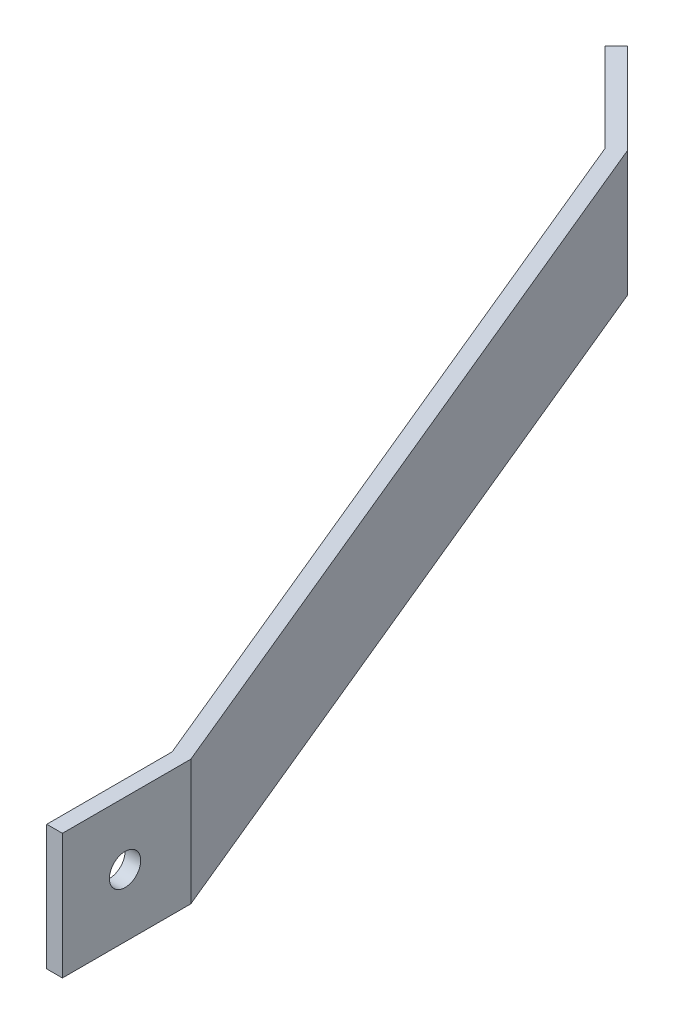
ISO-10303-21;
HEADER;
FILE_DESCRIPTION(('STEP AP214'),'2;1');
FILE_NAME('part.step','',(''),(''),'','','');
FILE_SCHEMA(('AUTOMOTIVE_DESIGN { 1 0 10303 214 1 1 1 1 }'));
ENDSEC;
DATA;
#1=APPLICATION_CONTEXT('core data for automotive mechanical design processes');
#2=APPLICATION_PROTOCOL_DEFINITION('international standard','automotive_design',2000,#1);
#3=PRODUCT_CONTEXT('',#1,'mechanical');
#4=PRODUCT('Part','Part','',(#3));
#5=PRODUCT_RELATED_PRODUCT_CATEGORY('part','',(#4));
#6=PRODUCT_DEFINITION_FORMATION('','',#4);
#7=PRODUCT_DEFINITION_CONTEXT('part definition',#1,'design');
#8=PRODUCT_DEFINITION('design','',#6,#7);
#9=PRODUCT_DEFINITION_SHAPE('','',#8);
#10=(LENGTH_UNIT() NAMED_UNIT(*) SI_UNIT(.MILLI.,.METRE.));
#11=(NAMED_UNIT(*) PLANE_ANGLE_UNIT() SI_UNIT($,.RADIAN.));
#12=(NAMED_UNIT(*) SI_UNIT($,.STERADIAN.) SOLID_ANGLE_UNIT());
#13=UNCERTAINTY_MEASURE_WITH_UNIT(LENGTH_MEASURE(1.E-05),#10,'distance_accuracy_value','');
#14=(GEOMETRIC_REPRESENTATION_CONTEXT(3) GLOBAL_UNCERTAINTY_ASSIGNED_CONTEXT((#13)) GLOBAL_UNIT_ASSIGNED_CONTEXT((#10,
#11,#12)) REPRESENTATION_CONTEXT('',''));
#15=CARTESIAN_POINT('',(0.,0.,0.));
#16=DIRECTION('',(0.,0.,1.));
#17=DIRECTION('',(1.,0.,0.));
#18=AXIS2_PLACEMENT_3D('',#15,#16,#17);
#19=CARTESIAN_POINT('',(411.586640789582,-414.988826497193,190.598388068805));
#20=DIRECTION('',(-0.707106781186547,0.,0.707106781186548));
#21=DIRECTION('',(0.707106781186548,0.,0.707106781186547));
#22=AXIS2_PLACEMENT_3D('',#19,#20,#21);
#23=PLANE('',#22);
#24=CARTESIAN_POINT('',(402.606384668511,-427.688826498046,181.618131947734));
#25=DIRECTION('',(-0.707106781186547,0.,0.707106781186548));
#26=DIRECTION('',(0.707106781186548,0.,0.707106781186547));
#27=AXIS2_PLACEMENT_3D('',#24,#25,#26);
#28=CIRCLE('',#27,3.17499999999997);
#29=CARTESIAN_POINT('',(404.851448698779,-427.688826498046,183.863195978002));
#30=VERTEX_POINT('',#29);
#31=EDGE_CURVE('E165',#30,#30,#28,.F.);
#32=ORIENTED_EDGE('',*,*,#31,.F.);
#33=EDGE_LOOP('',(#32));
#34=FACE_BOUND('',#33,.T.);
#35=DIRECTION('',(-0.707106781186548,0.,-0.707106781186547));
#36=VECTOR('',#35,1.);
#37=CARTESIAN_POINT('',(411.586640789582,-440.388826497193,190.598388068805));
#38=LINE('',#37,#36);
#39=CARTESIAN_POINT('',(412.033211790752,-440.388826497193,191.044959069975));
#40=VERTEX_POINT('',#39);
#41=CARTESIAN_POINT('',(393.626128547444,-440.388826497193,172.637875826667));
#42=VERTEX_POINT('',#41);
#43=EDGE_CURVE('E159',#40,#42,#38,.T.);
#44=ORIENTED_EDGE('',*,*,#43,.T.);
#45=DIRECTION('',(0.,-1.,0.));
#46=VECTOR('',#45,1.);
#47=CARTESIAN_POINT('',(393.626128547444,-414.988826497193,172.637875826667));
#48=LINE('',#47,#46);
#49=CARTESIAN_POINT('',(393.626128547444,-414.988826497193,172.637875826667));
#50=VERTEX_POINT('',#49);
#51=EDGE_CURVE('E13',#50,#42,#48,.T.);
#52=ORIENTED_EDGE('',*,*,#51,.F.);
#53=DIRECTION('',(-0.707106781186548,0.,-0.707106781186547));
#54=VECTOR('',#53,1.);
#55=CARTESIAN_POINT('',(411.586640789582,-414.988826497193,190.598388068805));
#56=LINE('',#55,#54);
#57=CARTESIAN_POINT('',(412.033211790752,-414.988826497193,191.044959069975));
#58=VERTEX_POINT('',#57);
#59=EDGE_CURVE('E104',#58,#50,#56,.T.);
#60=ORIENTED_EDGE('',*,*,#59,.F.);
#61=DIRECTION('',(0.,-1.,0.));
#62=VECTOR('',#61,1.);
#63=CARTESIAN_POINT('',(412.033211790752,-414.988826497193,191.044959069975));
#64=LINE('',#63,#62);
#65=EDGE_CURVE('E245',#58,#40,#64,.T.);
#66=ORIENTED_EDGE('',*,*,#65,.T.);
#67=EDGE_LOOP('',(#44,#52,#60,#66));
#68=FACE_BOUND('',#67,.T.);
#69=ADVANCED_FACE('F47',(#34,#68),#23,.F.);
#70=CARTESIAN_POINT('',(391.381064517177,-414.988826497193,174.882939856934));
#71=DIRECTION('',(-0.707106781186543,0.,-0.707106781186552));
#72=DIRECTION('',(-0.707106781186552,0.,0.707106781186543));
#73=AXIS2_PLACEMENT_3D('',#70,#71,#72);
#74=PLANE('',#73);
#75=DIRECTION('',(0.707106781186552,0.,-0.707106781186543));
#76=VECTOR('',#75,1.);
#77=CARTESIAN_POINT('',(391.381064517177,-440.388826497193,174.882939856934));
#78=LINE('',#77,#76);
#79=CARTESIAN_POINT('',(391.381064517177,-440.388826497193,174.882939856934));
#80=VERTEX_POINT('',#79);
#81=EDGE_CURVE('E164',#80,#42,#78,.T.);
#82=ORIENTED_EDGE('',*,*,#81,.F.);
#83=DIRECTION('',(0.,-1.,0.));
#84=VECTOR('',#83,1.);
#85=CARTESIAN_POINT('',(391.381064517177,-414.988826497193,174.882939856934));
#86=LINE('',#85,#84);
#87=CARTESIAN_POINT('',(391.381064517177,-414.988826497193,174.882939856934));
#88=VERTEX_POINT('',#87);
#89=EDGE_CURVE('E57',#88,#80,#86,.T.);
#90=ORIENTED_EDGE('',*,*,#89,.F.);
#91=DIRECTION('',(0.707106781186552,0.,-0.707106781186543));
#92=VECTOR('',#91,1.);
#93=CARTESIAN_POINT('',(391.381064517177,-414.988826497193,174.882939856934));
#94=LINE('',#93,#92);
#95=EDGE_CURVE('E279',#88,#50,#94,.T.);
#96=ORIENTED_EDGE('',*,*,#95,.T.);
#97=ORIENTED_EDGE('',*,*,#51,.T.);
#98=EDGE_LOOP('',(#82,#90,#96,#97));
#99=FACE_BOUND('',#98,.T.);
#100=ADVANCED_FACE('F277',(#99),#74,.T.);
#101=CARTESIAN_POINT('',(409.341576759315,-414.988826497193,192.843452099072));
#102=DIRECTION('',(-0.707106781186547,0.,0.707106781186548));
#103=DIRECTION('',(0.707106781186548,0.,0.707106781186547));
#104=AXIS2_PLACEMENT_3D('',#101,#102,#103);
#105=PLANE('',#104);
#106=CARTESIAN_POINT('',(400.361320638244,-427.688826498046,183.863195978002));
#107=DIRECTION('',(-0.707106781186547,0.,0.707106781186548));
#108=DIRECTION('',(0.707106781186548,0.,0.707106781186547));
#109=AXIS2_PLACEMENT_3D('',#106,#107,#108);
#110=CIRCLE('',#109,3.17499999999997);
#111=CARTESIAN_POINT('',(402.606384668511,-427.688826498046,186.108260008269));
#112=VERTEX_POINT('',#111);
#113=EDGE_CURVE('E50',#112,#112,#110,.F.);
#114=ORIENTED_EDGE('',*,*,#113,.T.);
#115=EDGE_LOOP('',(#114));
#116=FACE_BOUND('',#115,.T.);
#117=DIRECTION('',(-0.707106781186548,0.,-0.707106781186547));
#118=VECTOR('',#117,1.);
#119=CARTESIAN_POINT('',(409.341576759315,-440.388826497193,192.843452099072));
#120=LINE('',#119,#118);
#121=CARTESIAN_POINT('',(409.341576759315,-440.388826497193,192.843452099072));
#122=VERTEX_POINT('',#121);
#123=EDGE_CURVE('E169',#122,#80,#120,.T.);
#124=ORIENTED_EDGE('',*,*,#123,.F.);
#125=DIRECTION('',(0.,-1.,0.));
#126=VECTOR('',#125,1.);
#127=CARTESIAN_POINT('',(409.341576759315,-414.988826497193,192.843452099072));
#128=LINE('',#127,#126);
#129=CARTESIAN_POINT('',(409.341576759315,-414.988826497193,192.843452099072));
#130=VERTEX_POINT('',#129);
#131=EDGE_CURVE('E226',#130,#122,#128,.T.);
#132=ORIENTED_EDGE('',*,*,#131,.F.);
#133=DIRECTION('',(-0.707106781186548,0.,-0.707106781186547));
#134=VECTOR('',#133,1.);
#135=CARTESIAN_POINT('',(409.341576759315,-414.988826497193,192.843452099072));
#136=LINE('',#135,#134);
#137=EDGE_CURVE('E311',#130,#88,#136,.T.);
#138=ORIENTED_EDGE('',*,*,#137,.T.);
#139=ORIENTED_EDGE('',*,*,#89,.T.);
#140=EDGE_LOOP('',(#124,#132,#138,#139));
#141=FACE_BOUND('',#140,.T.);
#142=ADVANCED_FACE('F274',(#116,#141),#105,.T.);
#143=CARTESIAN_POINT('',(471.408428726179,-414.988826497193,342.686087887932));
#144=DIRECTION('',(-0.923879532508265,0.,0.382683432372385));
#145=DIRECTION('',(0.382683432372385,0.,0.923879532508265));
#146=AXIS2_PLACEMENT_3D('',#143,#144,#145);
#147=PLANE('',#146);
#148=DIRECTION('',(-0.382683432372385,0.,-0.923879532508265));
#149=VECTOR('',#148,1.);
#150=CARTESIAN_POINT('',(471.408428726179,-440.388826497193,342.686087887932));
#151=LINE('',#150,#149);
#152=CARTESIAN_POINT('',(471.408428726179,-440.388826497193,342.686087887932));
#153=VERTEX_POINT('',#152);
#154=EDGE_CURVE('E173',#153,#122,#151,.T.);
#155=ORIENTED_EDGE('',*,*,#154,.F.);
#156=DIRECTION('',(0.,-1.,0.));
#157=VECTOR('',#156,1.);
#158=CARTESIAN_POINT('',(471.408428726179,-414.988826497193,342.686087887932));
#159=LINE('',#158,#157);
#160=CARTESIAN_POINT('',(471.408428726179,-414.988826497193,342.686087887932));
#161=VERTEX_POINT('',#160);
#162=EDGE_CURVE('E221',#161,#153,#159,.T.);
#163=ORIENTED_EDGE('',*,*,#162,.F.);
#164=DIRECTION('',(-0.382683432372385,0.,-0.923879532508265));
#165=VECTOR('',#164,1.);
#166=CARTESIAN_POINT('',(471.408428726179,-414.988826497193,342.686087887932));
#167=LINE('',#166,#165);
#168=EDGE_CURVE('E145',#161,#130,#167,.T.);
#169=ORIENTED_EDGE('',*,*,#168,.T.);
#170=ORIENTED_EDGE('',*,*,#131,.T.);
#171=EDGE_LOOP('',(#155,#163,#169,#170));
#172=FACE_BOUND('',#171,.T.);
#173=ADVANCED_FACE('F269',(#172),#147,.T.);
#174=CARTESIAN_POINT('',(471.408428726179,-414.988826497193,368.086087887932));
#175=DIRECTION('',(-1.,0.,0.));
#176=DIRECTION('',(0.,0.,1.));
#177=AXIS2_PLACEMENT_3D('',#174,#175,#176);
#178=PLANE('',#177);
#179=CARTESIAN_POINT('',(471.408428726179,-427.688826497193,355.386087887932));
#180=DIRECTION('',(-1.,0.,0.));
#181=DIRECTION('',(0.,0.,1.));
#182=AXIS2_PLACEMENT_3D('',#179,#180,#181);
#183=CIRCLE('',#182,3.17500000000004);
#184=CARTESIAN_POINT('',(471.408428726179,-427.688826497193,358.561087887932));
#185=VERTEX_POINT('',#184);
#186=EDGE_CURVE('E188',#185,#185,#183,.F.);
#187=ORIENTED_EDGE('',*,*,#186,.T.);
#188=EDGE_LOOP('',(#187));
#189=FACE_BOUND('',#188,.T.);
#190=DIRECTION('',(0.,0.,-1.));
#191=VECTOR('',#190,1.);
#192=CARTESIAN_POINT('',(471.408428726179,-440.388826497193,368.086087887932));
#193=LINE('',#192,#191);
#194=CARTESIAN_POINT('',(471.408428726179,-440.388826497193,368.086087887932));
#195=VERTEX_POINT('',#194);
#196=EDGE_CURVE('E178',#195,#153,#193,.T.);
#197=ORIENTED_EDGE('',*,*,#196,.F.);
#198=DIRECTION('',(0.,-1.,0.));
#199=VECTOR('',#198,1.);
#200=CARTESIAN_POINT('',(471.408428726179,-414.988826497193,368.086087887932));
#201=LINE('',#200,#199);
#202=CARTESIAN_POINT('',(471.408428726179,-414.988826497193,368.086087887932));
#203=VERTEX_POINT('',#202);
#204=EDGE_CURVE('E129',#203,#195,#201,.T.);
#205=ORIENTED_EDGE('',*,*,#204,.F.);
#206=DIRECTION('',(0.,0.,-1.));
#207=VECTOR('',#206,1.);
#208=CARTESIAN_POINT('',(471.408428726179,-414.988826497193,368.086087887932));
#209=LINE('',#208,#207);
#210=EDGE_CURVE('E140',#203,#161,#209,.T.);
#211=ORIENTED_EDGE('',*,*,#210,.T.);
#212=ORIENTED_EDGE('',*,*,#162,.T.);
#213=EDGE_LOOP('',(#197,#205,#211,#212));
#214=FACE_BOUND('',#213,.T.);
#215=ADVANCED_FACE('F266',(#189,#214),#178,.T.);
#216=CARTESIAN_POINT('',(474.583428726179,-414.988826497193,368.086087887932));
#217=DIRECTION('',(0.,0.,1.));
#218=DIRECTION('',(1.,0.,0.));
#219=AXIS2_PLACEMENT_3D('',#216,#217,#218);
#220=PLANE('',#219);
#221=DIRECTION('',(-1.,0.,0.));
#222=VECTOR('',#221,1.);
#223=CARTESIAN_POINT('',(474.583428726179,-440.388826497193,368.086087887932));
#224=LINE('',#223,#222);
#225=CARTESIAN_POINT('',(474.583428726179,-440.388826497193,368.086087887932));
#226=VERTEX_POINT('',#225);
#227=EDGE_CURVE('E127',#226,#195,#224,.T.);
#228=ORIENTED_EDGE('',*,*,#227,.F.);
#229=DIRECTION('',(0.,-1.,0.));
#230=VECTOR('',#229,1.);
#231=CARTESIAN_POINT('',(474.583428726179,-414.988826497193,368.086087887932));
#232=LINE('',#231,#230);
#233=CARTESIAN_POINT('',(474.583428726179,-414.988826497193,368.086087887932));
#234=VERTEX_POINT('',#233);
#235=EDGE_CURVE('E121',#234,#226,#232,.T.);
#236=ORIENTED_EDGE('',*,*,#235,.F.);
#237=DIRECTION('',(-1.,0.,0.));
#238=VECTOR('',#237,1.);
#239=CARTESIAN_POINT('',(474.583428726179,-414.988826497193,368.086087887932));
#240=LINE('',#239,#238);
#241=EDGE_CURVE('E125',#234,#203,#240,.T.);
#242=ORIENTED_EDGE('',*,*,#241,.T.);
#243=ORIENTED_EDGE('',*,*,#204,.T.);
#244=EDGE_LOOP('',(#228,#236,#242,#243));
#245=FACE_BOUND('',#244,.T.);
#246=ADVANCED_FACE('F123',(#245),#220,.T.);
#247=CARTESIAN_POINT('',(474.583428726179,-414.988826497193,368.086087887932));
#248=DIRECTION('',(-1.,0.,0.));
#249=DIRECTION('',(0.,0.,1.));
#250=AXIS2_PLACEMENT_3D('',#247,#248,#249);
#251=PLANE('',#250);
#252=CARTESIAN_POINT('',(474.583428726179,-427.688826497193,355.386087887932));
#253=DIRECTION('',(1.,0.,0.));
#254=DIRECTION('',(0.,0.,-1.));
#255=AXIS2_PLACEMENT_3D('',#252,#253,#254);
#256=CIRCLE('',#255,3.17500000000004);
#257=CARTESIAN_POINT('',(474.583428726179,-427.688826497193,358.561087887932));
#258=VERTEX_POINT('',#257);
#259=EDGE_CURVE('E183',#258,#258,#256,.T.);
#260=ORIENTED_EDGE('',*,*,#259,.F.);
#261=EDGE_LOOP('',(#260));
#262=FACE_BOUND('',#261,.T.);
#263=DIRECTION('',(0.,0.,-1.));
#264=VECTOR('',#263,1.);
#265=CARTESIAN_POINT('',(474.583428726179,-440.388826497193,368.086087887932));
#266=LINE('',#265,#264);
#267=CARTESIAN_POINT('',(474.583428726179,-440.388826497193,342.054541121488));
#268=VERTEX_POINT('',#267);
#269=EDGE_CURVE('E92',#226,#268,#266,.T.);
#270=ORIENTED_EDGE('',*,*,#269,.T.);
#271=DIRECTION('',(0.,-1.,0.));
#272=VECTOR('',#271,1.);
#273=CARTESIAN_POINT('',(474.583428726179,-414.988826497193,342.054541121488));
#274=LINE('',#273,#272);
#275=CARTESIAN_POINT('',(474.583428726179,-414.988826497193,342.054541121488));
#276=VERTEX_POINT('',#275);
#277=EDGE_CURVE('E130',#276,#268,#274,.T.);
#278=ORIENTED_EDGE('',*,*,#277,.F.);
#279=DIRECTION('',(0.,0.,-1.));
#280=VECTOR('',#279,1.);
#281=CARTESIAN_POINT('',(474.583428726179,-414.988826497193,368.086087887932));
#282=LINE('',#281,#280);
#283=EDGE_CURVE('E132',#234,#276,#282,.T.);
#284=ORIENTED_EDGE('',*,*,#283,.F.);
#285=ORIENTED_EDGE('',*,*,#235,.T.);
#286=EDGE_LOOP('',(#270,#278,#284,#285));
#287=FACE_BOUND('',#286,.T.);
#288=ADVANCED_FACE('F133',(#262,#287),#251,.F.);
#289=CARTESIAN_POINT('',(474.341746241892,-414.988826497193,341.471067990149));
#290=DIRECTION('',(-0.923879532508265,0.,0.382683432372385));
#291=DIRECTION('',(0.382683432372385,0.,0.923879532508265));
#292=AXIS2_PLACEMENT_3D('',#289,#290,#291);
#293=PLANE('',#292);
#294=DIRECTION('',(-0.382683432372385,0.,-0.923879532508265));
#295=VECTOR('',#294,1.);
#296=CARTESIAN_POINT('',(474.341746241892,-440.388826497193,341.471067990149));
#297=LINE('',#296,#295);
#298=EDGE_CURVE('E98',#268,#40,#297,.T.);
#299=ORIENTED_EDGE('',*,*,#298,.T.);
#300=ORIENTED_EDGE('',*,*,#65,.F.);
#301=DIRECTION('',(-0.382683432372385,0.,-0.923879532508265));
#302=VECTOR('',#301,1.);
#303=CARTESIAN_POINT('',(474.341746241892,-414.988826497193,341.471067990149));
#304=LINE('',#303,#302);
#305=EDGE_CURVE('E65',#276,#58,#304,.T.);
#306=ORIENTED_EDGE('',*,*,#305,.F.);
#307=ORIENTED_EDGE('',*,*,#277,.T.);
#308=EDGE_LOOP('',(#299,#300,#306,#307));
#309=FACE_BOUND('',#308,.T.);
#310=ADVANCED_FACE('F281',(#309),#293,.F.);
#311=CARTESIAN_POINT('',(0.,-414.988826497193,0.));
#312=DIRECTION('',(0.,-1.,0.));
#313=DIRECTION('',(-1.,0.,0.));
#314=AXIS2_PLACEMENT_3D('',#311,#312,#313);
#315=PLANE('',#314);
#316=ORIENTED_EDGE('',*,*,#59,.T.);
#317=ORIENTED_EDGE('',*,*,#95,.F.);
#318=ORIENTED_EDGE('',*,*,#137,.F.);
#319=ORIENTED_EDGE('',*,*,#168,.F.);
#320=ORIENTED_EDGE('',*,*,#210,.F.);
#321=ORIENTED_EDGE('',*,*,#241,.F.);
#322=ORIENTED_EDGE('',*,*,#283,.T.);
#323=ORIENTED_EDGE('',*,*,#305,.T.);
#324=EDGE_LOOP('',(#316,#317,#318,#319,#320,#321,#322,#323));
#325=FACE_BOUND('',#324,.T.);
#326=ADVANCED_FACE('F137',(#325),#315,.F.);
#327=CARTESIAN_POINT('',(0.,-440.388826497193,0.));
#328=DIRECTION('',(0.,-1.,0.));
#329=DIRECTION('',(-1.,0.,0.));
#330=AXIS2_PLACEMENT_3D('',#327,#328,#329);
#331=PLANE('',#330);
#332=ORIENTED_EDGE('',*,*,#43,.F.);
#333=ORIENTED_EDGE('',*,*,#298,.F.);
#334=ORIENTED_EDGE('',*,*,#269,.F.);
#335=ORIENTED_EDGE('',*,*,#227,.T.);
#336=ORIENTED_EDGE('',*,*,#196,.T.);
#337=ORIENTED_EDGE('',*,*,#154,.T.);
#338=ORIENTED_EDGE('',*,*,#123,.T.);
#339=ORIENTED_EDGE('',*,*,#81,.T.);
#340=EDGE_LOOP('',(#332,#333,#334,#335,#336,#337,#338,#339));
#341=FACE_BOUND('',#340,.T.);
#342=ADVANCED_FACE('F263',(#341),#331,.T.);
#343=CARTESIAN_POINT('',(400.36132063824,-427.688826498046,183.863195978006));
#344=DIRECTION('',(0.707106781186552,0.,-0.707106781186543));
#345=DIRECTION('',(-0.707106781186543,0.,-0.707106781186552));
#346=AXIS2_PLACEMENT_3D('',#343,#344,#345);
#347=CYLINDRICAL_SURFACE('',#346,3.17499999999997);
#348=ORIENTED_EDGE('',*,*,#113,.F.);
#349=EDGE_LOOP('',(#348));
#350=FACE_BOUND('',#349,.T.);
#351=ORIENTED_EDGE('',*,*,#31,.T.);
#352=EDGE_LOOP('',(#351));
#353=FACE_BOUND('',#352,.T.);
#354=ADVANCED_FACE('F404',(#350,#353),#347,.F.);
#355=CARTESIAN_POINT('',(471.408428726179,-427.688826497193,355.386087887932));
#356=DIRECTION('',(-1.,0.,0.));
#357=DIRECTION('',(0.,0.,1.));
#358=AXIS2_PLACEMENT_3D('',#355,#356,#357);
#359=CYLINDRICAL_SURFACE('',#358,3.17500000000004);
#360=CARTESIAN_POINT('',(471.408428726179,-427.688826497193,358.561087887932));
#361=CARTESIAN_POINT('',(471.441501642845,-427.688826497193,358.561087887932));
#362=CARTESIAN_POINT('',(471.474574559512,-427.688826497193,358.561087887932));
#363=CARTESIAN_POINT('',(471.540720392845,-427.688826497193,358.561087887932));
#364=CARTESIAN_POINT('',(471.573793309512,-427.688826497193,358.561087887932));
#365=CARTESIAN_POINT('',(471.639939142845,-427.688826497193,358.561087887932));
#366=CARTESIAN_POINT('',(471.673012059512,-427.688826497193,358.561087887932));
#367=CARTESIAN_POINT('',(471.739157892845,-427.688826497193,358.561087887932));
#368=CARTESIAN_POINT('',(471.772230809512,-427.688826497193,358.561087887932));
#369=CARTESIAN_POINT('',(471.838376642845,-427.688826497193,358.561087887932));
#370=CARTESIAN_POINT('',(471.871449559512,-427.688826497193,358.561087887932));
#371=CARTESIAN_POINT('',(471.937595392845,-427.688826497193,358.561087887932));
#372=CARTESIAN_POINT('',(471.970668309512,-427.688826497193,358.561087887932));
#373=CARTESIAN_POINT('',(472.036814142845,-427.688826497193,358.561087887932));
#374=CARTESIAN_POINT('',(472.069887059512,-427.688826497193,358.561087887932));
#375=CARTESIAN_POINT('',(472.136032892845,-427.688826497193,358.561087887932));
#376=CARTESIAN_POINT('',(472.169105809512,-427.688826497193,358.561087887932));
#377=CARTESIAN_POINT('',(472.235251642845,-427.688826497193,358.561087887932));
#378=CARTESIAN_POINT('',(472.268324559512,-427.688826497193,358.561087887932));
#379=CARTESIAN_POINT('',(472.334470392845,-427.688826497193,358.561087887932));
#380=CARTESIAN_POINT('',(472.367543309512,-427.688826497193,358.561087887932));
#381=CARTESIAN_POINT('',(472.433689142845,-427.688826497193,358.561087887932));
#382=CARTESIAN_POINT('',(472.466762059512,-427.688826497193,358.561087887932));
#383=CARTESIAN_POINT('',(472.532907892845,-427.688826497193,358.561087887932));
#384=CARTESIAN_POINT('',(472.565980809512,-427.688826497193,358.561087887932));
#385=CARTESIAN_POINT('',(472.632126642845,-427.688826497193,358.561087887932));
#386=CARTESIAN_POINT('',(472.665199559512,-427.688826497193,358.561087887932));
#387=CARTESIAN_POINT('',(472.731345392845,-427.688826497193,358.561087887932));
#388=CARTESIAN_POINT('',(472.764418309512,-427.688826497193,358.561087887932));
#389=CARTESIAN_POINT('',(472.830564142845,-427.688826497193,358.561087887932));
#390=CARTESIAN_POINT('',(472.863637059512,-427.688826497193,358.561087887932));
#391=CARTESIAN_POINT('',(472.929782892845,-427.688826497193,358.561087887932));
#392=CARTESIAN_POINT('',(472.962855809512,-427.688826497193,358.561087887932));
#393=CARTESIAN_POINT('',(473.029001642845,-427.688826497193,358.561087887932));
#394=CARTESIAN_POINT('',(473.062074559512,-427.688826497193,358.561087887932));
#395=CARTESIAN_POINT('',(473.128220392845,-427.688826497193,358.561087887932));
#396=CARTESIAN_POINT('',(473.161293309512,-427.688826497193,358.561087887932));
#397=CARTESIAN_POINT('',(473.227439142845,-427.688826497193,358.561087887932));
#398=CARTESIAN_POINT('',(473.260512059512,-427.688826497193,358.561087887932));
#399=CARTESIAN_POINT('',(473.326657892845,-427.688826497193,358.561087887932));
#400=CARTESIAN_POINT('',(473.359730809512,-427.688826497193,358.561087887932));
#401=CARTESIAN_POINT('',(473.425876642845,-427.688826497193,358.561087887932));
#402=CARTESIAN_POINT('',(473.458949559512,-427.688826497193,358.561087887932));
#403=CARTESIAN_POINT('',(473.525095392845,-427.688826497193,358.561087887932));
#404=CARTESIAN_POINT('',(473.558168309512,-427.688826497193,358.561087887932));
#405=CARTESIAN_POINT('',(473.624314142845,-427.688826497193,358.561087887932));
#406=CARTESIAN_POINT('',(473.657387059512,-427.688826497193,358.561087887932));
#407=CARTESIAN_POINT('',(473.723532892845,-427.688826497193,358.561087887932));
#408=CARTESIAN_POINT('',(473.756605809512,-427.688826497193,358.561087887932));
#409=CARTESIAN_POINT('',(473.822751642845,-427.688826497193,358.561087887932));
#410=CARTESIAN_POINT('',(473.855824559512,-427.688826497193,358.561087887932));
#411=CARTESIAN_POINT('',(473.921970392845,-427.688826497193,358.561087887932));
#412=CARTESIAN_POINT('',(473.955043309512,-427.688826497193,358.561087887932));
#413=CARTESIAN_POINT('',(474.021189142845,-427.688826497193,358.561087887932));
#414=CARTESIAN_POINT('',(474.054262059512,-427.688826497193,358.561087887932));
#415=CARTESIAN_POINT('',(474.120407892845,-427.688826497193,358.561087887932));
#416=CARTESIAN_POINT('',(474.153480809512,-427.688826497193,358.561087887932));
#417=CARTESIAN_POINT('',(474.219626642845,-427.688826497193,358.561087887932));
#418=CARTESIAN_POINT('',(474.252699559512,-427.688826497193,358.561087887932));
#419=CARTESIAN_POINT('',(474.318845392845,-427.688826497193,358.561087887932));
#420=CARTESIAN_POINT('',(474.351918309512,-427.688826497193,358.561087887932));
#421=CARTESIAN_POINT('',(474.418064142845,-427.688826497193,358.561087887932));
#422=CARTESIAN_POINT('',(474.451137059512,-427.688826497193,358.561087887932));
#423=CARTESIAN_POINT('',(474.517282892845,-427.688826497193,358.561087887932));
#424=CARTESIAN_POINT('',(474.550355809512,-427.688826497193,358.561087887932));
#425=CARTESIAN_POINT('',(474.583428726179,-427.688826497193,358.561087887932));
#426=B_SPLINE_CURVE_WITH_KNOTS('',3,(#360,#361,#362,#363,#364,#365,#366,#367,#368,#369,#370,
#371,#372,#373,#374,#375,#376,#377,#378,#379,#380,#381,#382,#383,#384,#385,#386,#387,#388,#389,
#390,#391,#392,#393,#394,#395,#396,#397,#398,#399,#400,#401,#402,#403,#404,#405,#406,#407,#408,
#409,#410,#411,#412,#413,#414,#415,#416,#417,#418,#419,#420,#421,#422,#423,#424,#425),
.UNSPECIFIED.,.F.,.F.,(4,2,2,2,2,2,2,2,2,2,2,2,2,2,2,2,2,2,2,2,2,2,2,2,2,2,2,2,2,2,2,2,4),(0.,
0.0992187499999631,0.198437499999982,0.297656249999945,0.396874999999963,0.496093749999982,
0.595312499999945,0.694531249999963,0.793749999999982,0.892968749999945,0.992187499999964,
1.09140624999993,1.19062499999995,1.28984374999996,1.38906249999993,1.48828124999995,
1.58749999999996,1.68671874999993,1.78593749999995,1.88515624999991,1.98437499999993,
2.08359374999995,2.18281249999991,2.28203124999993,2.38124999999995,2.48046874999991,
2.57968749999993,2.67890624999989,2.77812499999991,2.87734374999993,2.97656249999989,
3.07578124999991,3.17499999999993),.UNSPECIFIED.);
#427=EDGE_CURVE('BSEAM436',#185,#258,#426,.T.);
#428=ORIENTED_EDGE('',*,*,#186,.F.);
#429=ORIENTED_EDGE('',*,*,#259,.T.);
#430=ORIENTED_EDGE('',*,*,#427,.T.);
#431=ORIENTED_EDGE('',*,*,#427,.F.);
#432=EDGE_LOOP('',(#428,#430,#429,#431));
#433=FACE_BOUND('',#432,.T.);
#434=ADVANCED_FACE('F436',(#433),#359,.F.);
#435=CLOSED_SHELL('',(#69,#100,#142,#173,#215,#246,#288,#310,#326,#342,#354,#434));
#436=MANIFOLD_SOLID_BREP('B2',#435);
#437=ADVANCED_BREP_SHAPE_REPRESENTATION('',(#18,#436),#14);
#438=SHAPE_DEFINITION_REPRESENTATION(#9,#437);
ENDSEC;
END-ISO-10303-21;
